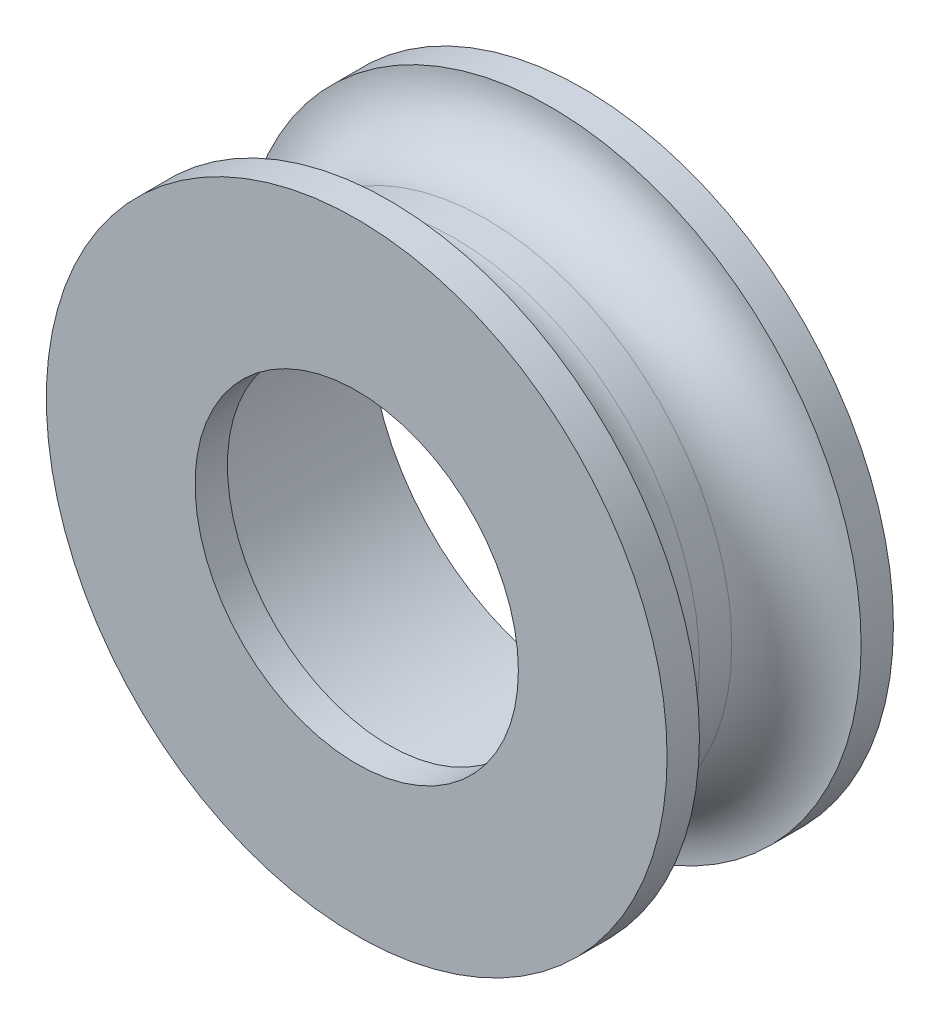
ISO-10303-21;
HEADER;
FILE_DESCRIPTION(('STEP AP214'),'2;1');
FILE_NAME('part.step','',(''),(''),'','','');
FILE_SCHEMA(('AUTOMOTIVE_DESIGN { 1 0 10303 214 1 1 1 1 }'));
ENDSEC;
DATA;
#1=APPLICATION_CONTEXT('core data for automotive mechanical design processes');
#2=APPLICATION_PROTOCOL_DEFINITION('international standard','automotive_design',2000,#1);
#3=PRODUCT_CONTEXT('',#1,'mechanical');
#4=PRODUCT('Part','Part','',(#3));
#5=PRODUCT_RELATED_PRODUCT_CATEGORY('part','',(#4));
#6=PRODUCT_DEFINITION_FORMATION('','',#4);
#7=PRODUCT_DEFINITION_CONTEXT('part definition',#1,'design');
#8=PRODUCT_DEFINITION('design','',#6,#7);
#9=PRODUCT_DEFINITION_SHAPE('','',#8);
#10=(LENGTH_UNIT() NAMED_UNIT(*) SI_UNIT(.MILLI.,.METRE.));
#11=(NAMED_UNIT(*) PLANE_ANGLE_UNIT() SI_UNIT($,.RADIAN.));
#12=(NAMED_UNIT(*) SI_UNIT($,.STERADIAN.) SOLID_ANGLE_UNIT());
#13=UNCERTAINTY_MEASURE_WITH_UNIT(LENGTH_MEASURE(1.E-05),#10,'distance_accuracy_value','');
#14=(GEOMETRIC_REPRESENTATION_CONTEXT(3) GLOBAL_UNCERTAINTY_ASSIGNED_CONTEXT((#13)) GLOBAL_UNIT_ASSIGNED_CONTEXT((#10,
#11,#12)) REPRESENTATION_CONTEXT('',''));
#15=CARTESIAN_POINT('',(0.,0.,0.));
#16=DIRECTION('',(0.,0.,1.));
#17=DIRECTION('',(1.,0.,0.));
#18=AXIS2_PLACEMENT_3D('',#15,#16,#17);
#19=CARTESIAN_POINT('',(0.,0.,5.));
#20=DIRECTION('',(0.,0.,-1.));
#21=DIRECTION('',(-1.,0.,0.));
#22=AXIS2_PLACEMENT_3D('',#19,#20,#21);
#23=CYLINDRICAL_SURFACE('',#22,7.6);
#24=CARTESIAN_POINT('',(0.,0.,2.));
#25=DIRECTION('',(0.,0.,1.));
#26=DIRECTION('',(1.,0.,0.));
#27=AXIS2_PLACEMENT_3D('',#24,#25,#26);
#28=CIRCLE('',#27,7.6);
#29=CARTESIAN_POINT('',(7.6,0.,2.));
#30=VERTEX_POINT('',#29);
#31=EDGE_CURVE('E11',#30,#30,#28,.T.);
#32=ORIENTED_EDGE('',*,*,#31,.T.);
#33=EDGE_LOOP('',(#32));
#34=FACE_BOUND('',#33,.T.);
#35=CARTESIAN_POINT('',(0.,0.,3.));
#36=DIRECTION('',(0.,0.,1.));
#37=DIRECTION('',(1.,0.,0.));
#38=AXIS2_PLACEMENT_3D('',#35,#36,#37);
#39=CIRCLE('',#38,7.6);
#40=CARTESIAN_POINT('',(7.6,0.,3.));
#41=VERTEX_POINT('',#40);
#42=EDGE_CURVE('E53',#41,#41,#39,.F.);
#43=ORIENTED_EDGE('',*,*,#42,.T.);
#44=EDGE_LOOP('',(#43));
#45=FACE_BOUND('',#44,.T.);
#46=ADVANCED_FACE('F45',(#34,#45),#23,.T.);
#47=CARTESIAN_POINT('',(0.,0.,5.));
#48=DIRECTION('',(0.,0.,-1.));
#49=DIRECTION('',(-1.,0.,0.));
#50=AXIS2_PLACEMENT_3D('',#47,#48,#49);
#51=CYLINDRICAL_SURFACE('',#50,6.6);
#52=CARTESIAN_POINT('',(0.,0.,5.));
#53=DIRECTION('',(0.,0.,1.));
#54=DIRECTION('',(1.,0.,0.));
#55=AXIS2_PLACEMENT_3D('',#52,#53,#54);
#56=CIRCLE('',#55,6.6);
#57=CARTESIAN_POINT('',(6.6,0.,5.));
#58=VERTEX_POINT('',#57);
#59=EDGE_CURVE('E58',#58,#58,#56,.T.);
#60=ORIENTED_EDGE('',*,*,#59,.T.);
#61=EDGE_LOOP('',(#60));
#62=FACE_BOUND('',#61,.T.);
#63=CARTESIAN_POINT('',(0.,0.,-1.));
#64=DIRECTION('',(0.,0.,1.));
#65=DIRECTION('',(1.,0.,0.));
#66=AXIS2_PLACEMENT_3D('',#63,#64,#65);
#67=CIRCLE('',#66,6.6);
#68=CARTESIAN_POINT('',(6.6,0.,-1.));
#69=VERTEX_POINT('',#68);
#70=EDGE_CURVE('E86',#69,#69,#67,.T.);
#71=ORIENTED_EDGE('',*,*,#70,.F.);
#72=EDGE_LOOP('',(#71));
#73=FACE_BOUND('',#72,.T.);
#74=ADVANCED_FACE('F97',(#62,#73),#51,.F.);
#75=CARTESIAN_POINT('',(0.,0.,5.));
#76=DIRECTION('',(0.,0.,1.));
#77=DIRECTION('',(1.,0.,0.));
#78=AXIS2_PLACEMENT_3D('',#75,#76,#77);
#79=PLANE('',#78);
#80=CARTESIAN_POINT('',(0.,0.,5.));
#81=DIRECTION('',(0.,0.,1.));
#82=DIRECTION('',(1.,0.,0.));
#83=AXIS2_PLACEMENT_3D('',#80,#81,#82);
#84=CIRCLE('',#83,5.);
#85=CARTESIAN_POINT('',(5.,0.,5.));
#86=VERTEX_POINT('',#85);
#87=EDGE_CURVE('E66',#86,#86,#84,.T.);
#88=ORIENTED_EDGE('',*,*,#87,.T.);
#89=EDGE_LOOP('',(#88));
#90=FACE_BOUND('',#89,.T.);
#91=ORIENTED_EDGE('',*,*,#59,.F.);
#92=EDGE_LOOP('',(#91));
#93=FACE_BOUND('',#92,.T.);
#94=ADVANCED_FACE('F99',(#90,#93),#79,.F.);
#95=CARTESIAN_POINT('',(0.,0.,6.));
#96=DIRECTION('',(0.,0.,-1.));
#97=DIRECTION('',(-1.,0.,0.));
#98=AXIS2_PLACEMENT_3D('',#95,#96,#97);
#99=CYLINDRICAL_SURFACE('',#98,9.6);
#100=CARTESIAN_POINT('',(0.,0.,6.));
#101=DIRECTION('',(0.,0.,1.));
#102=DIRECTION('',(1.,0.,0.));
#103=AXIS2_PLACEMENT_3D('',#100,#101,#102);
#104=CIRCLE('',#103,9.6);
#105=CARTESIAN_POINT('',(9.6,0.,6.));
#106=VERTEX_POINT('',#105);
#107=EDGE_CURVE('E70',#106,#106,#104,.T.);
#108=ORIENTED_EDGE('',*,*,#107,.F.);
#109=EDGE_LOOP('',(#108));
#110=FACE_BOUND('',#109,.T.);
#111=CARTESIAN_POINT('',(0.,0.,5.));
#112=DIRECTION('',(0.,0.,1.));
#113=DIRECTION('',(1.,0.,0.));
#114=AXIS2_PLACEMENT_3D('',#111,#112,#113);
#115=CIRCLE('',#114,9.6);
#116=CARTESIAN_POINT('',(9.6,0.,5.));
#117=VERTEX_POINT('',#116);
#118=EDGE_CURVE('E71',#117,#117,#115,.T.);
#119=ORIENTED_EDGE('',*,*,#118,.T.);
#120=EDGE_LOOP('',(#119));
#121=FACE_BOUND('',#120,.T.);
#122=ADVANCED_FACE('F106',(#110,#121),#99,.T.);
#123=CARTESIAN_POINT('',(0.,0.,6.));
#124=DIRECTION('',(0.,0.,-1.));
#125=DIRECTION('',(-1.,0.,0.));
#126=AXIS2_PLACEMENT_3D('',#123,#124,#125);
#127=CYLINDRICAL_SURFACE('',#126,5.);
#128=CARTESIAN_POINT('',(0.,0.,6.));
#129=DIRECTION('',(0.,0.,1.));
#130=DIRECTION('',(1.,0.,0.));
#131=AXIS2_PLACEMENT_3D('',#128,#129,#130);
#132=CIRCLE('',#131,5.);
#133=CARTESIAN_POINT('',(5.,0.,6.));
#134=VERTEX_POINT('',#133);
#135=EDGE_CURVE('E63',#134,#134,#132,.T.);
#136=ORIENTED_EDGE('',*,*,#135,.T.);
#137=EDGE_LOOP('',(#136));
#138=FACE_BOUND('',#137,.T.);
#139=ORIENTED_EDGE('',*,*,#87,.F.);
#140=EDGE_LOOP('',(#139));
#141=FACE_BOUND('',#140,.T.);
#142=ADVANCED_FACE('F132',(#138,#141),#127,.F.);
#143=CARTESIAN_POINT('',(0.,0.,6.));
#144=DIRECTION('',(0.,0.,1.));
#145=DIRECTION('',(1.,0.,0.));
#146=AXIS2_PLACEMENT_3D('',#143,#144,#145);
#147=PLANE('',#146);
#148=ORIENTED_EDGE('',*,*,#107,.T.);
#149=EDGE_LOOP('',(#148));
#150=FACE_BOUND('',#149,.T.);
#151=ORIENTED_EDGE('',*,*,#135,.F.);
#152=EDGE_LOOP('',(#151));
#153=FACE_BOUND('',#152,.T.);
#154=ADVANCED_FACE('F126',(#150,#153),#147,.T.);
#155=CARTESIAN_POINT('',(0.,0.,-1.));
#156=DIRECTION('',(0.,0.,1.));
#157=DIRECTION('',(1.,0.,0.));
#158=AXIS2_PLACEMENT_3D('',#155,#156,#157);
#159=CYLINDRICAL_SURFACE('',#158,9.6);
#160=CARTESIAN_POINT('',(0.,0.,-1.));
#161=DIRECTION('',(0.,0.,1.));
#162=DIRECTION('',(1.,0.,0.));
#163=AXIS2_PLACEMENT_3D('',#160,#161,#162);
#164=CIRCLE('',#163,9.6);
#165=CARTESIAN_POINT('',(9.6,0.,-1.));
#166=VERTEX_POINT('',#165);
#167=EDGE_CURVE('E75',#166,#166,#164,.T.);
#168=ORIENTED_EDGE('',*,*,#167,.T.);
#169=EDGE_LOOP('',(#168));
#170=FACE_BOUND('',#169,.T.);
#171=CARTESIAN_POINT('',(0.,0.,0.));
#172=DIRECTION('',(0.,0.,1.));
#173=DIRECTION('',(1.,0.,0.));
#174=AXIS2_PLACEMENT_3D('',#171,#172,#173);
#175=CIRCLE('',#174,9.6);
#176=CARTESIAN_POINT('',(9.6,0.,0.));
#177=VERTEX_POINT('',#176);
#178=EDGE_CURVE('E82',#177,#177,#175,.T.);
#179=ORIENTED_EDGE('',*,*,#178,.F.);
#180=EDGE_LOOP('',(#179));
#181=FACE_BOUND('',#180,.T.);
#182=ADVANCED_FACE('F120',(#170,#181),#159,.T.);
#183=CARTESIAN_POINT('',(0.,0.,-1.));
#184=DIRECTION('',(0.,0.,1.));
#185=DIRECTION('',(1.,0.,0.));
#186=AXIS2_PLACEMENT_3D('',#183,#184,#185);
#187=PLANE('',#186);
#188=ORIENTED_EDGE('',*,*,#70,.T.);
#189=EDGE_LOOP('',(#188));
#190=FACE_BOUND('',#189,.T.);
#191=ORIENTED_EDGE('',*,*,#167,.F.);
#192=EDGE_LOOP('',(#191));
#193=FACE_BOUND('',#192,.T.);
#194=ADVANCED_FACE('F94',(#190,#193),#187,.F.);
#195=CARTESIAN_POINT('',(0.,0.,2.));
#196=DIRECTION('',(0.,0.,1.));
#197=DIRECTION('',(1.,0.,0.));
#198=AXIS2_PLACEMENT_3D('',#195,#196,#197);
#199=TOROIDAL_SURFACE('',#198,9.6,2.);
#200=ORIENTED_EDGE('',*,*,#178,.T.);
#201=EDGE_LOOP('',(#200));
#202=FACE_BOUND('',#201,.T.);
#203=ORIENTED_EDGE('',*,*,#31,.F.);
#204=EDGE_LOOP('',(#203));
#205=FACE_BOUND('',#204,.T.);
#206=ADVANCED_FACE('F112',(#202,#205),#199,.F.);
#207=CARTESIAN_POINT('',(0.,0.,3.));
#208=DIRECTION('',(0.,0.,1.));
#209=DIRECTION('',(1.,0.,0.));
#210=AXIS2_PLACEMENT_3D('',#207,#208,#209);
#211=TOROIDAL_SURFACE('',#210,9.6,2.);
#212=ORIENTED_EDGE('',*,*,#42,.F.);
#213=EDGE_LOOP('',(#212));
#214=FACE_BOUND('',#213,.T.);
#215=ORIENTED_EDGE('',*,*,#118,.F.);
#216=EDGE_LOOP('',(#215));
#217=FACE_BOUND('',#216,.T.);
#218=ADVANCED_FACE('F47',(#214,#217),#211,.F.);
#219=CLOSED_SHELL('',(#46,#74,#94,#122,#142,#154,#182,#194,#206,#218));
#220=MANIFOLD_SOLID_BREP('B2',#219);
#221=ADVANCED_BREP_SHAPE_REPRESENTATION('',(#18,#220),#14);
#222=SHAPE_DEFINITION_REPRESENTATION(#9,#221);
ENDSEC;
END-ISO-10303-21;
